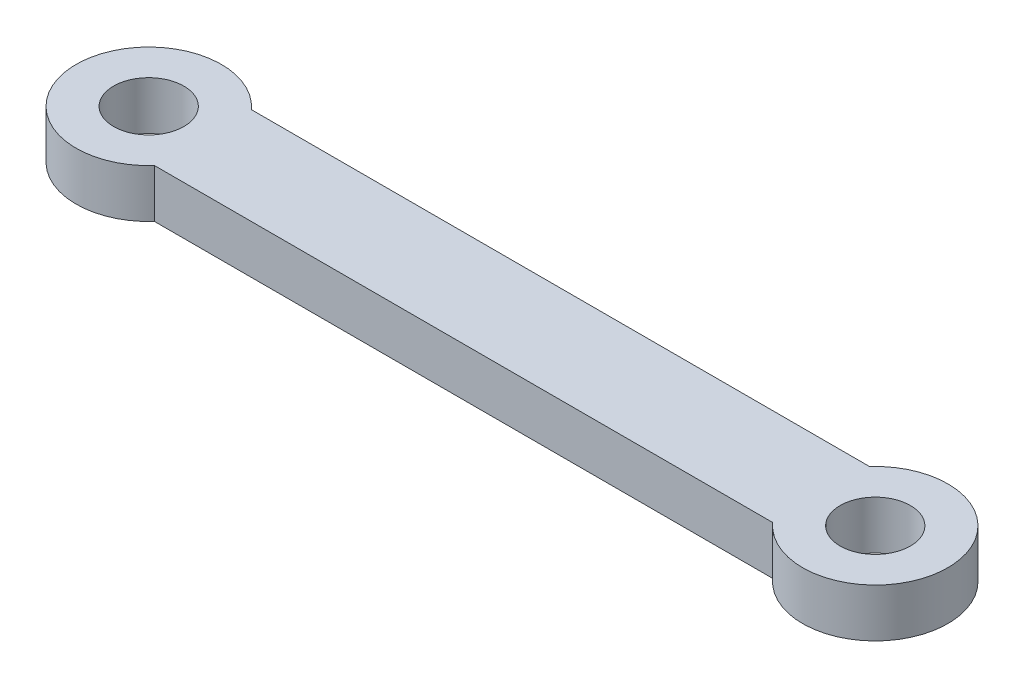
ISO-10303-21;
HEADER;
FILE_DESCRIPTION(('STEP AP214'),'2;1');
FILE_NAME('part.step','',(''),(''),'','','');
FILE_SCHEMA(('AUTOMOTIVE_DESIGN { 1 0 10303 214 1 1 1 1 }'));
ENDSEC;
DATA;
#1=APPLICATION_CONTEXT('core data for automotive mechanical design processes');
#2=APPLICATION_PROTOCOL_DEFINITION('international standard','automotive_design',2000,#1);
#3=PRODUCT_CONTEXT('',#1,'mechanical');
#4=PRODUCT('Part','Part','',(#3));
#5=PRODUCT_RELATED_PRODUCT_CATEGORY('part','',(#4));
#6=PRODUCT_DEFINITION_FORMATION('','',#4);
#7=PRODUCT_DEFINITION_CONTEXT('part definition',#1,'design');
#8=PRODUCT_DEFINITION('design','',#6,#7);
#9=PRODUCT_DEFINITION_SHAPE('','',#8);
#10=(LENGTH_UNIT() NAMED_UNIT(*) SI_UNIT(.MILLI.,.METRE.));
#11=(NAMED_UNIT(*) PLANE_ANGLE_UNIT() SI_UNIT($,.RADIAN.));
#12=(NAMED_UNIT(*) SI_UNIT($,.STERADIAN.) SOLID_ANGLE_UNIT());
#13=UNCERTAINTY_MEASURE_WITH_UNIT(LENGTH_MEASURE(1.E-05),#10,'distance_accuracy_value','');
#14=(GEOMETRIC_REPRESENTATION_CONTEXT(3) GLOBAL_UNCERTAINTY_ASSIGNED_CONTEXT((#13)) GLOBAL_UNIT_ASSIGNED_CONTEXT((#10,
#11,#12)) REPRESENTATION_CONTEXT('',''));
#15=CARTESIAN_POINT('',(0.,0.,0.));
#16=DIRECTION('',(0.,0.,1.));
#17=DIRECTION('',(1.,0.,0.));
#18=AXIS2_PLACEMENT_3D('',#15,#16,#17);
#19=CARTESIAN_POINT('',(15.,2.,0.));
#20=DIRECTION('',(0.,-1.,0.));
#21=DIRECTION('',(0.,0.,-1.));
#22=AXIS2_PLACEMENT_3D('',#19,#20,#21);
#23=CYLINDRICAL_SURFACE('',#22,3.);
#24=CARTESIAN_POINT('',(15.,0.,0.));
#25=DIRECTION('',(0.,1.,0.));
#26=DIRECTION('',(0.,0.,1.));
#27=AXIS2_PLACEMENT_3D('',#24,#25,#26);
#28=CIRCLE('',#27,3.);
#29=CARTESIAN_POINT('',(12.7639320225002,0.,2.));
#30=VERTEX_POINT('',#29);
#31=CARTESIAN_POINT('',(12.7639320225002,0.,-2.));
#32=VERTEX_POINT('',#31);
#33=EDGE_CURVE('E96',#30,#32,#28,.T.);
#34=ORIENTED_EDGE('',*,*,#33,.T.);
#35=DIRECTION('',(0.,-1.,0.));
#36=VECTOR('',#35,1.);
#37=CARTESIAN_POINT('',(12.7639320225002,2.,-2.));
#38=LINE('',#37,#36);
#39=CARTESIAN_POINT('',(12.7639320225002,2.,-2.));
#40=VERTEX_POINT('',#39);
#41=EDGE_CURVE('E11',#40,#32,#38,.T.);
#42=ORIENTED_EDGE('',*,*,#41,.F.);
#43=CARTESIAN_POINT('',(15.,2.,0.));
#44=DIRECTION('',(0.,1.,0.));
#45=DIRECTION('',(0.,0.,1.));
#46=AXIS2_PLACEMENT_3D('',#43,#44,#45);
#47=CIRCLE('',#46,3.);
#48=CARTESIAN_POINT('',(12.7639320225002,2.,2.));
#49=VERTEX_POINT('',#48);
#50=EDGE_CURVE('E74',#49,#40,#47,.T.);
#51=ORIENTED_EDGE('',*,*,#50,.F.);
#52=DIRECTION('',(0.,-1.,0.));
#53=VECTOR('',#52,1.);
#54=CARTESIAN_POINT('',(12.7639320225002,2.,2.));
#55=LINE('',#54,#53);
#56=EDGE_CURVE('E95',#49,#30,#55,.T.);
#57=ORIENTED_EDGE('',*,*,#56,.T.);
#58=EDGE_LOOP('',(#34,#42,#51,#57));
#59=FACE_BOUND('',#58,.T.);
#60=ADVANCED_FACE('F32',(#59),#23,.T.);
#61=CARTESIAN_POINT('',(0.,2.,-2.));
#62=DIRECTION('',(0.,0.,-1.));
#63=DIRECTION('',(-1.,0.,0.));
#64=AXIS2_PLACEMENT_3D('',#61,#62,#63);
#65=PLANE('',#64);
#66=DIRECTION('',(1.,0.,0.));
#67=VECTOR('',#66,1.);
#68=CARTESIAN_POINT('',(0.,0.,-2.));
#69=LINE('',#68,#67);
#70=CARTESIAN_POINT('',(-12.7639320225002,0.,-2.));
#71=VERTEX_POINT('',#70);
#72=EDGE_CURVE('E84',#71,#32,#69,.T.);
#73=ORIENTED_EDGE('',*,*,#72,.F.);
#74=DIRECTION('',(0.,-1.,0.));
#75=VECTOR('',#74,1.);
#76=CARTESIAN_POINT('',(-12.7639320225002,2.,-2.));
#77=LINE('',#76,#75);
#78=CARTESIAN_POINT('',(-12.7639320225002,2.,-2.));
#79=VERTEX_POINT('',#78);
#80=EDGE_CURVE('E40',#79,#71,#77,.T.);
#81=ORIENTED_EDGE('',*,*,#80,.F.);
#82=DIRECTION('',(1.,0.,0.));
#83=VECTOR('',#82,1.);
#84=CARTESIAN_POINT('',(0.,2.,-2.));
#85=LINE('',#84,#83);
#86=EDGE_CURVE('E82',#79,#40,#85,.T.);
#87=ORIENTED_EDGE('',*,*,#86,.T.);
#88=ORIENTED_EDGE('',*,*,#41,.T.);
#89=EDGE_LOOP('',(#73,#81,#87,#88));
#90=FACE_BOUND('',#89,.T.);
#91=ADVANCED_FACE('F81',(#90),#65,.T.);
#92=CARTESIAN_POINT('',(-15.,2.,0.));
#93=DIRECTION('',(0.,-1.,0.));
#94=DIRECTION('',(0.,0.,-1.));
#95=AXIS2_PLACEMENT_3D('',#92,#93,#94);
#96=CYLINDRICAL_SURFACE('',#95,3.);
#97=CARTESIAN_POINT('',(-15.,0.,0.));
#98=DIRECTION('',(0.,1.,0.));
#99=DIRECTION('',(0.,0.,1.));
#100=AXIS2_PLACEMENT_3D('',#97,#98,#99);
#101=CIRCLE('',#100,3.);
#102=CARTESIAN_POINT('',(-12.7639320225002,0.,2.));
#103=VERTEX_POINT('',#102);
#104=EDGE_CURVE('E63',#71,#103,#101,.T.);
#105=ORIENTED_EDGE('',*,*,#104,.T.);
#106=DIRECTION('',(0.,-1.,0.));
#107=VECTOR('',#106,1.);
#108=CARTESIAN_POINT('',(-12.7639320225002,2.,2.));
#109=LINE('',#108,#107);
#110=CARTESIAN_POINT('',(-12.7639320225002,2.,2.));
#111=VERTEX_POINT('',#110);
#112=EDGE_CURVE('E85',#111,#103,#109,.T.);
#113=ORIENTED_EDGE('',*,*,#112,.F.);
#114=CARTESIAN_POINT('',(-15.,2.,0.));
#115=DIRECTION('',(0.,1.,0.));
#116=DIRECTION('',(0.,0.,1.));
#117=AXIS2_PLACEMENT_3D('',#114,#115,#116);
#118=CIRCLE('',#117,3.);
#119=EDGE_CURVE('E86',#79,#111,#118,.T.);
#120=ORIENTED_EDGE('',*,*,#119,.F.);
#121=ORIENTED_EDGE('',*,*,#80,.T.);
#122=EDGE_LOOP('',(#105,#113,#120,#121));
#123=FACE_BOUND('',#122,.T.);
#124=ADVANCED_FACE('F87',(#123),#96,.T.);
#125=CARTESIAN_POINT('',(0.,2.,2.));
#126=DIRECTION('',(0.,0.,-1.));
#127=DIRECTION('',(-1.,0.,0.));
#128=AXIS2_PLACEMENT_3D('',#125,#126,#127);
#129=PLANE('',#128);
#130=DIRECTION('',(1.,0.,0.));
#131=VECTOR('',#130,1.);
#132=CARTESIAN_POINT('',(0.,0.,2.));
#133=LINE('',#132,#131);
#134=EDGE_CURVE('E69',#103,#30,#133,.T.);
#135=ORIENTED_EDGE('',*,*,#134,.T.);
#136=ORIENTED_EDGE('',*,*,#56,.F.);
#137=DIRECTION('',(1.,0.,0.));
#138=VECTOR('',#137,1.);
#139=CARTESIAN_POINT('',(0.,2.,2.));
#140=LINE('',#139,#138);
#141=EDGE_CURVE('E48',#111,#49,#140,.T.);
#142=ORIENTED_EDGE('',*,*,#141,.F.);
#143=ORIENTED_EDGE('',*,*,#112,.T.);
#144=EDGE_LOOP('',(#135,#136,#142,#143));
#145=FACE_BOUND('',#144,.T.);
#146=ADVANCED_FACE('F104',(#145),#129,.F.);
#147=CARTESIAN_POINT('',(0.,2.,0.));
#148=DIRECTION('',(0.,1.,0.));
#149=DIRECTION('',(0.,0.,1.));
#150=AXIS2_PLACEMENT_3D('',#147,#148,#149);
#151=PLANE('',#150);
#152=CARTESIAN_POINT('',(-15.,2.,0.));
#153=DIRECTION('',(0.,1.,0.));
#154=DIRECTION('',(0.,0.,1.));
#155=AXIS2_PLACEMENT_3D('',#152,#153,#154);
#156=CIRCLE('',#155,1.45);
#157=CARTESIAN_POINT('',(-15.,2.,1.45));
#158=VERTEX_POINT('',#157);
#159=EDGE_CURVE('E140',#158,#158,#156,.T.);
#160=ORIENTED_EDGE('',*,*,#159,.F.);
#161=EDGE_LOOP('',(#160));
#162=FACE_BOUND('',#161,.T.);
#163=CARTESIAN_POINT('',(15.,2.,0.));
#164=DIRECTION('',(0.,1.,0.));
#165=DIRECTION('',(0.,0.,1.));
#166=AXIS2_PLACEMENT_3D('',#163,#164,#165);
#167=CIRCLE('',#166,1.45);
#168=CARTESIAN_POINT('',(15.,2.,1.45));
#169=VERTEX_POINT('',#168);
#170=EDGE_CURVE('E145',#169,#169,#167,.T.);
#171=ORIENTED_EDGE('',*,*,#170,.F.);
#172=EDGE_LOOP('',(#171));
#173=FACE_BOUND('',#172,.T.);
#174=ORIENTED_EDGE('',*,*,#50,.T.);
#175=ORIENTED_EDGE('',*,*,#86,.F.);
#176=ORIENTED_EDGE('',*,*,#119,.T.);
#177=ORIENTED_EDGE('',*,*,#141,.T.);
#178=EDGE_LOOP('',(#174,#175,#176,#177));
#179=FACE_BOUND('',#178,.T.);
#180=ADVANCED_FACE('F89',(#162,#173,#179),#151,.T.);
#181=CARTESIAN_POINT('',(0.,0.,0.));
#182=DIRECTION('',(0.,1.,0.));
#183=DIRECTION('',(0.,0.,1.));
#184=AXIS2_PLACEMENT_3D('',#181,#182,#183);
#185=PLANE('',#184);
#186=CARTESIAN_POINT('',(-15.,0.,0.));
#187=DIRECTION('',(0.,1.,0.));
#188=DIRECTION('',(0.,0.,1.));
#189=AXIS2_PLACEMENT_3D('',#186,#187,#188);
#190=CIRCLE('',#189,1.45);
#191=CARTESIAN_POINT('',(-15.,0.,1.45));
#192=VERTEX_POINT('',#191);
#193=EDGE_CURVE('E99',#192,#192,#190,.T.);
#194=ORIENTED_EDGE('',*,*,#193,.T.);
#195=EDGE_LOOP('',(#194));
#196=FACE_BOUND('',#195,.T.);
#197=CARTESIAN_POINT('',(15.,0.,0.));
#198=DIRECTION('',(0.,1.,0.));
#199=DIRECTION('',(0.,0.,1.));
#200=AXIS2_PLACEMENT_3D('',#197,#198,#199);
#201=CIRCLE('',#200,1.45);
#202=CARTESIAN_POINT('',(15.,0.,1.45));
#203=VERTEX_POINT('',#202);
#204=EDGE_CURVE('E141',#203,#203,#201,.T.);
#205=ORIENTED_EDGE('',*,*,#204,.T.);
#206=EDGE_LOOP('',(#205));
#207=FACE_BOUND('',#206,.T.);
#208=ORIENTED_EDGE('',*,*,#33,.F.);
#209=ORIENTED_EDGE('',*,*,#134,.F.);
#210=ORIENTED_EDGE('',*,*,#104,.F.);
#211=ORIENTED_EDGE('',*,*,#72,.T.);
#212=EDGE_LOOP('',(#208,#209,#210,#211));
#213=FACE_BOUND('',#212,.T.);
#214=ADVANCED_FACE('F107',(#196,#207,#213),#185,.F.);
#215=CARTESIAN_POINT('',(15.,0.,0.));
#216=DIRECTION('',(0.,1.,0.));
#217=DIRECTION('',(0.,0.,1.));
#218=AXIS2_PLACEMENT_3D('',#215,#216,#217);
#219=CYLINDRICAL_SURFACE('',#218,1.45);
#220=ORIENTED_EDGE('',*,*,#204,.F.);
#221=EDGE_LOOP('',(#220));
#222=FACE_BOUND('',#221,.T.);
#223=ORIENTED_EDGE('',*,*,#170,.T.);
#224=EDGE_LOOP('',(#223));
#225=FACE_BOUND('',#224,.T.);
#226=ADVANCED_FACE('F122',(#222,#225),#219,.F.);
#227=CARTESIAN_POINT('',(-15.,0.,0.));
#228=DIRECTION('',(0.,1.,0.));
#229=DIRECTION('',(0.,0.,1.));
#230=AXIS2_PLACEMENT_3D('',#227,#228,#229);
#231=CYLINDRICAL_SURFACE('',#230,1.45);
#232=ORIENTED_EDGE('',*,*,#193,.F.);
#233=EDGE_LOOP('',(#232));
#234=FACE_BOUND('',#233,.T.);
#235=ORIENTED_EDGE('',*,*,#159,.T.);
#236=EDGE_LOOP('',(#235));
#237=FACE_BOUND('',#236,.T.);
#238=ADVANCED_FACE('F129',(#234,#237),#231,.F.);
#239=CLOSED_SHELL('',(#60,#91,#124,#146,#180,#214,#226,#238));
#240=MANIFOLD_SOLID_BREP('B2',#239);
#241=ADVANCED_BREP_SHAPE_REPRESENTATION('',(#18,#240),#14);
#242=SHAPE_DEFINITION_REPRESENTATION(#9,#241);
ENDSEC;
END-ISO-10303-21;
